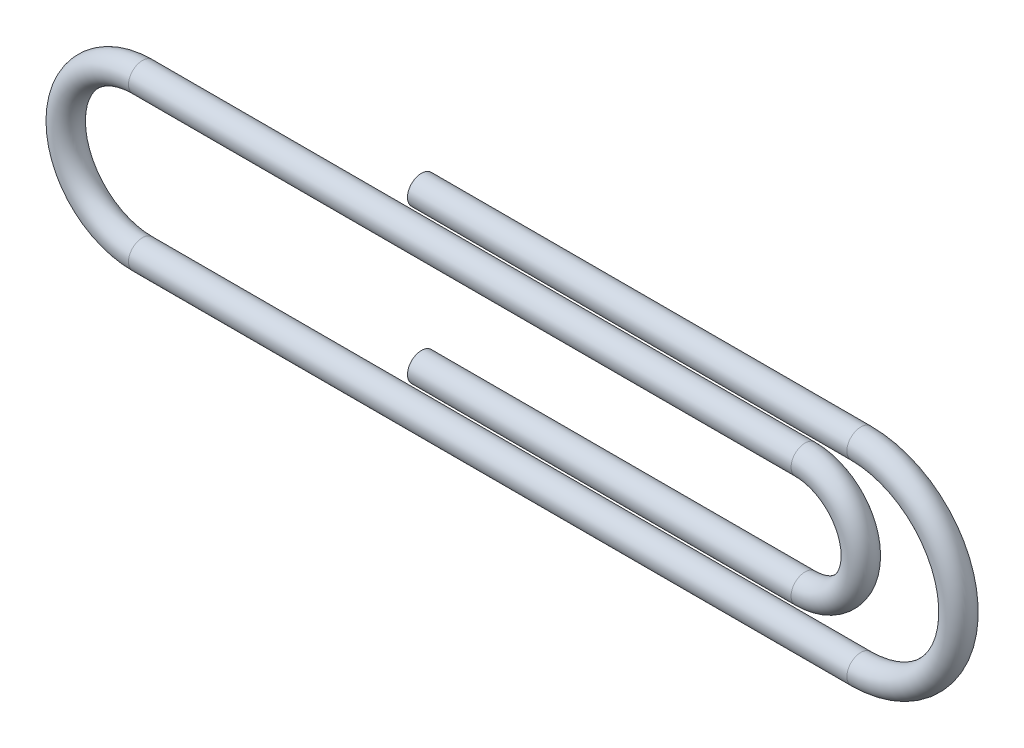
ISO-10303-21;
HEADER;
FILE_DESCRIPTION(('STEP AP214'),'2;1');
FILE_NAME('part.step','',(''),(''),'','','');
FILE_SCHEMA(('AUTOMOTIVE_DESIGN { 1 0 10303 214 1 1 1 1 }'));
ENDSEC;
DATA;
#1=APPLICATION_CONTEXT('core data for automotive mechanical design processes');
#2=APPLICATION_PROTOCOL_DEFINITION('international standard','automotive_design',2000,#1);
#3=PRODUCT_CONTEXT('',#1,'mechanical');
#4=PRODUCT('Part','Part','',(#3));
#5=PRODUCT_RELATED_PRODUCT_CATEGORY('part','',(#4));
#6=PRODUCT_DEFINITION_FORMATION('','',#4);
#7=PRODUCT_DEFINITION_CONTEXT('part definition',#1,'design');
#8=PRODUCT_DEFINITION('design','',#6,#7);
#9=PRODUCT_DEFINITION_SHAPE('','',#8);
#10=(LENGTH_UNIT() NAMED_UNIT(*) SI_UNIT(.MILLI.,.METRE.));
#11=(NAMED_UNIT(*) PLANE_ANGLE_UNIT() SI_UNIT($,.RADIAN.));
#12=(NAMED_UNIT(*) SI_UNIT($,.STERADIAN.) SOLID_ANGLE_UNIT());
#13=UNCERTAINTY_MEASURE_WITH_UNIT(LENGTH_MEASURE(1.E-05),#10,'distance_accuracy_value','');
#14=(GEOMETRIC_REPRESENTATION_CONTEXT(3) GLOBAL_UNCERTAINTY_ASSIGNED_CONTEXT((#13)) GLOBAL_UNIT_ASSIGNED_CONTEXT((#10,
#11,#12)) REPRESENTATION_CONTEXT('',''));
#15=CARTESIAN_POINT('',(0.,0.,0.));
#16=DIRECTION('',(0.,0.,1.));
#17=DIRECTION('',(1.,0.,0.));
#18=AXIS2_PLACEMENT_3D('',#15,#16,#17);
#19=CARTESIAN_POINT('',(0.,-2.,0.));
#20=DIRECTION('',(-1.,0.,0.));
#21=DIRECTION('',(0.,-1.,0.));
#22=AXIS2_PLACEMENT_3D('',#19,#20,#21);
#23=CYLINDRICAL_SURFACE('',#22,0.5);
#24=CARTESIAN_POINT('',(0.,-2.,0.));
#25=DIRECTION('',(-1.,0.,0.));
#26=DIRECTION('',(0.,0.,-1.));
#27=AXIS2_PLACEMENT_3D('',#24,#25,#26);
#28=CIRCLE('',#27,0.5);
#29=CARTESIAN_POINT('',(0.,-2.5,0.));
#30=VERTEX_POINT('',#29);
#31=EDGE_CURVE('E36',#30,#30,#28,.T.);
#32=ORIENTED_EDGE('',*,*,#31,.T.);
#33=EDGE_LOOP('',(#32));
#34=FACE_BOUND('',#33,.T.);
#35=CARTESIAN_POINT('',(-13.75,-2.,0.));
#36=DIRECTION('',(-1.,0.,0.));
#37=DIRECTION('',(0.,0.,-1.));
#38=AXIS2_PLACEMENT_3D('',#35,#36,#37);
#39=CIRCLE('',#38,0.5);
#40=CARTESIAN_POINT('',(-13.75,-2.,-0.5));
#41=VERTEX_POINT('',#40);
#42=EDGE_CURVE('E10',#41,#41,#39,.T.);
#43=ORIENTED_EDGE('',*,*,#42,.F.);
#44=EDGE_LOOP('',(#43));
#45=FACE_BOUND('',#44,.T.);
#46=ADVANCED_FACE('F30',(#34,#45),#23,.T.);
#47=CARTESIAN_POINT('',(0.,0.,0.));
#48=DIRECTION('',(0.,0.,-1.));
#49=DIRECTION('',(-1.,0.,0.));
#50=AXIS2_PLACEMENT_3D('',#47,#48,#49);
#51=TOROIDAL_SURFACE('',#50,2.,0.5);
#52=CARTESIAN_POINT('',(0.,2.,0.));
#53=DIRECTION('',(1.,0.,0.));
#54=DIRECTION('',(0.,0.,-1.));
#55=AXIS2_PLACEMENT_3D('',#52,#53,#54);
#56=CIRCLE('',#55,0.5);
#57=CARTESIAN_POINT('',(0.,2.5,0.));
#58=VERTEX_POINT('',#57);
#59=EDGE_CURVE('E40',#58,#58,#56,.T.);
#60=CARTESIAN_POINT('',(0.,0.,0.));
#61=DIRECTION('',(0.,0.,-1.));
#62=DIRECTION('',(-1.,0.,0.));
#63=AXIS2_PLACEMENT_3D('',#60,#61,#62);
#64=CIRCLE('',#63,2.5);
#65=EDGE_CURVE('',#58,#30,#64,.T.);
#66=ORIENTED_EDGE('',*,*,#59,.T.);
#67=ORIENTED_EDGE('',*,*,#31,.F.);
#68=ORIENTED_EDGE('',*,*,#65,.T.);
#69=ORIENTED_EDGE('',*,*,#65,.F.);
#70=EDGE_LOOP('',(#66,#68,#67,#69));
#71=FACE_BOUND('',#70,.T.);
#72=ADVANCED_FACE('F80',(#71),#51,.T.);
#73=CARTESIAN_POINT('',(-23.75,2.,0.));
#74=DIRECTION('',(1.,0.,0.));
#75=DIRECTION('',(0.,0.,-1.));
#76=AXIS2_PLACEMENT_3D('',#73,#74,#75);
#77=CYLINDRICAL_SURFACE('',#76,0.5);
#78=CARTESIAN_POINT('',(-23.75,2.,0.));
#79=DIRECTION('',(1.,0.,0.));
#80=DIRECTION('',(0.,0.,-1.));
#81=AXIS2_PLACEMENT_3D('',#78,#79,#80);
#82=CIRCLE('',#81,0.5);
#83=CARTESIAN_POINT('',(-23.75,2.5,0.));
#84=VERTEX_POINT('',#83);
#85=EDGE_CURVE('E44',#84,#84,#82,.T.);
#86=ORIENTED_EDGE('',*,*,#85,.T.);
#87=EDGE_LOOP('',(#86));
#88=FACE_BOUND('',#87,.T.);
#89=ORIENTED_EDGE('',*,*,#59,.F.);
#90=EDGE_LOOP('',(#89));
#91=FACE_BOUND('',#90,.T.);
#92=ADVANCED_FACE('F84',(#88,#91),#77,.T.);
#93=CARTESIAN_POINT('',(-23.75,-0.75,0.));
#94=DIRECTION('',(0.,0.,-1.));
#95=DIRECTION('',(-1.,0.,0.));
#96=AXIS2_PLACEMENT_3D('',#93,#94,#95);
#97=TOROIDAL_SURFACE('',#96,2.75,0.5);
#98=CARTESIAN_POINT('',(-23.75,-3.5,0.));
#99=DIRECTION('',(-1.,0.,0.));
#100=DIRECTION('',(0.,0.,-1.));
#101=AXIS2_PLACEMENT_3D('',#98,#99,#100);
#102=CIRCLE('',#101,0.5);
#103=CARTESIAN_POINT('',(-23.75,-4.,0.));
#104=VERTEX_POINT('',#103);
#105=EDGE_CURVE('E49',#104,#104,#102,.T.);
#106=CARTESIAN_POINT('',(-23.75,-0.75,0.));
#107=DIRECTION('',(0.,0.,-1.));
#108=DIRECTION('',(-1.,0.,0.));
#109=AXIS2_PLACEMENT_3D('',#106,#107,#108);
#110=CIRCLE('',#109,3.25);
#111=EDGE_CURVE('',#104,#84,#110,.T.);
#112=ORIENTED_EDGE('',*,*,#105,.T.);
#113=ORIENTED_EDGE('',*,*,#85,.F.);
#114=ORIENTED_EDGE('',*,*,#111,.T.);
#115=ORIENTED_EDGE('',*,*,#111,.F.);
#116=EDGE_LOOP('',(#112,#114,#113,#115));
#117=FACE_BOUND('',#116,.T.);
#118=ADVANCED_FACE('F90',(#117),#97,.T.);
#119=CARTESIAN_POINT('',(2.,-3.5,0.));
#120=DIRECTION('',(-1.,0.,0.));
#121=DIRECTION('',(0.,0.,1.));
#122=AXIS2_PLACEMENT_3D('',#119,#120,#121);
#123=CYLINDRICAL_SURFACE('',#122,0.5);
#124=CARTESIAN_POINT('',(2.,-3.5,0.));
#125=DIRECTION('',(-1.,0.,0.));
#126=DIRECTION('',(0.,0.,-1.));
#127=AXIS2_PLACEMENT_3D('',#124,#125,#126);
#128=CIRCLE('',#127,0.5);
#129=CARTESIAN_POINT('',(2.,-4.,0.));
#130=VERTEX_POINT('',#129);
#131=EDGE_CURVE('E52',#130,#130,#128,.T.);
#132=ORIENTED_EDGE('',*,*,#131,.T.);
#133=EDGE_LOOP('',(#132));
#134=FACE_BOUND('',#133,.T.);
#135=ORIENTED_EDGE('',*,*,#105,.F.);
#136=EDGE_LOOP('',(#135));
#137=FACE_BOUND('',#136,.T.);
#138=ADVANCED_FACE('F97',(#134,#137),#123,.T.);
#139=CARTESIAN_POINT('',(2.,0.,0.));
#140=DIRECTION('',(0.,0.,-1.));
#141=DIRECTION('',(-1.,0.,0.));
#142=AXIS2_PLACEMENT_3D('',#139,#140,#141);
#143=TOROIDAL_SURFACE('',#142,3.5,0.5);
#144=CARTESIAN_POINT('',(2.,3.5,0.));
#145=DIRECTION('',(1.,0.,0.));
#146=DIRECTION('',(0.,0.,-1.));
#147=AXIS2_PLACEMENT_3D('',#144,#145,#146);
#148=CIRCLE('',#147,0.5);
#149=CARTESIAN_POINT('',(2.,4.,0.));
#150=VERTEX_POINT('',#149);
#151=EDGE_CURVE('E55',#150,#150,#148,.T.);
#152=CARTESIAN_POINT('',(2.,0.,0.));
#153=DIRECTION('',(0.,0.,-1.));
#154=DIRECTION('',(-1.,0.,0.));
#155=AXIS2_PLACEMENT_3D('',#152,#153,#154);
#156=CIRCLE('',#155,4.);
#157=EDGE_CURVE('',#150,#130,#156,.T.);
#158=ORIENTED_EDGE('',*,*,#151,.T.);
#159=ORIENTED_EDGE('',*,*,#131,.F.);
#160=ORIENTED_EDGE('',*,*,#157,.T.);
#161=ORIENTED_EDGE('',*,*,#157,.F.);
#162=EDGE_LOOP('',(#158,#160,#159,#161));
#163=FACE_BOUND('',#162,.T.);
#164=ADVANCED_FACE('F62',(#163),#143,.T.);
#165=CARTESIAN_POINT('',(2.,3.5,0.));
#166=DIRECTION('',(-1.,0.,0.));
#167=DIRECTION('',(0.,0.,1.));
#168=AXIS2_PLACEMENT_3D('',#165,#166,#167);
#169=CYLINDRICAL_SURFACE('',#168,0.5);
#170=ORIENTED_EDGE('',*,*,#151,.F.);
#171=EDGE_LOOP('',(#170));
#172=FACE_BOUND('',#171,.T.);
#173=CARTESIAN_POINT('',(-13.75,3.5,0.));
#174=DIRECTION('',(1.,0.,0.));
#175=DIRECTION('',(0.,0.,-1.));
#176=AXIS2_PLACEMENT_3D('',#173,#174,#175);
#177=CIRCLE('',#176,0.5);
#178=CARTESIAN_POINT('',(-13.75,3.5,-0.5));
#179=VERTEX_POINT('',#178);
#180=EDGE_CURVE('E56',#179,#179,#177,.T.);
#181=ORIENTED_EDGE('',*,*,#180,.T.);
#182=EDGE_LOOP('',(#181));
#183=FACE_BOUND('',#182,.T.);
#184=ADVANCED_FACE('F65',(#172,#183),#169,.T.);
#185=CARTESIAN_POINT('',(-13.75,-2.,0.));
#186=DIRECTION('',(-1.,0.,0.));
#187=DIRECTION('',(0.,0.,-1.));
#188=AXIS2_PLACEMENT_3D('',#185,#186,#187);
#189=PLANE('',#188);
#190=ORIENTED_EDGE('',*,*,#42,.T.);
#191=EDGE_LOOP('',(#190));
#192=FACE_BOUND('',#191,.T.);
#193=ADVANCED_FACE('F68',(#192),#189,.T.);
#194=CARTESIAN_POINT('',(-13.75,3.5,0.));
#195=DIRECTION('',(1.,0.,0.));
#196=DIRECTION('',(0.,0.,-1.));
#197=AXIS2_PLACEMENT_3D('',#194,#195,#196);
#198=PLANE('',#197);
#199=ORIENTED_EDGE('',*,*,#180,.F.);
#200=EDGE_LOOP('',(#199));
#201=FACE_BOUND('',#200,.T.);
#202=ADVANCED_FACE('F72',(#201),#198,.F.);
#203=CLOSED_SHELL('',(#46,#72,#92,#118,#138,#164,#184,#193,#202));
#204=MANIFOLD_SOLID_BREP('B2',#203);
#205=ADVANCED_BREP_SHAPE_REPRESENTATION('',(#18,#204),#14);
#206=SHAPE_DEFINITION_REPRESENTATION(#9,#205);
ENDSEC;
END-ISO-10303-21;
